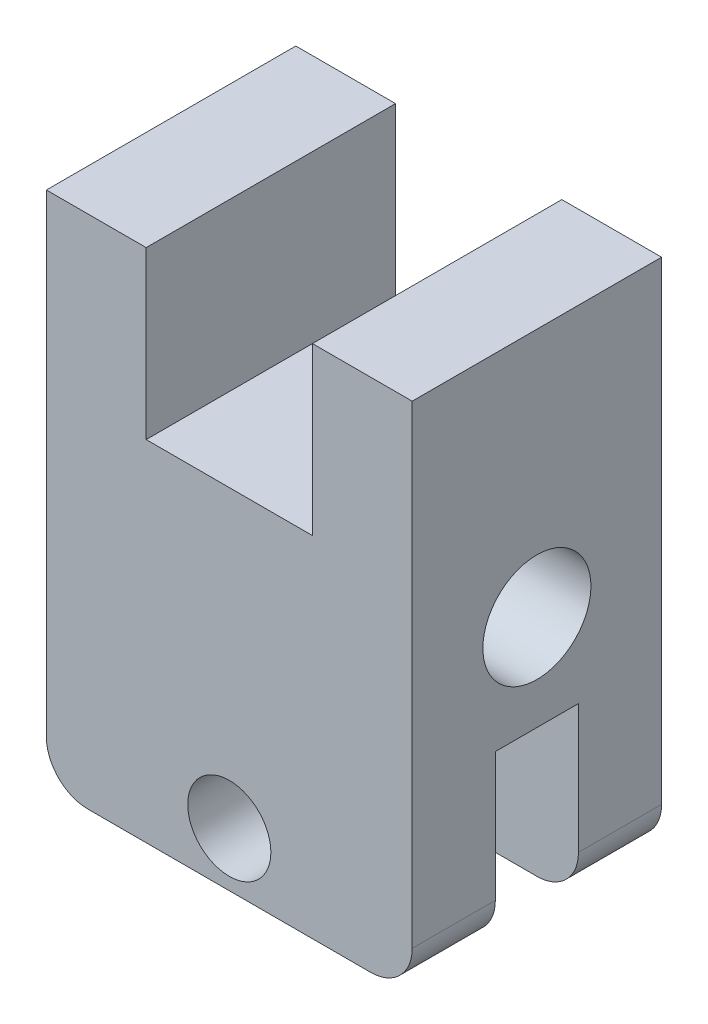
ISO-10303-21;
HEADER;
FILE_DESCRIPTION(('STEP AP214'),'2;1');
FILE_NAME('part.step','',(''),(''),'','','');
FILE_SCHEMA(('AUTOMOTIVE_DESIGN { 1 0 10303 214 1 1 1 1 }'));
ENDSEC;
DATA;
#1=APPLICATION_CONTEXT('core data for automotive mechanical design processes');
#2=APPLICATION_PROTOCOL_DEFINITION('international standard','automotive_design',2000,#1);
#3=PRODUCT_CONTEXT('',#1,'mechanical');
#4=PRODUCT('Part','Part','',(#3));
#5=PRODUCT_RELATED_PRODUCT_CATEGORY('part','',(#4));
#6=PRODUCT_DEFINITION_FORMATION('','',#4);
#7=PRODUCT_DEFINITION_CONTEXT('part definition',#1,'design');
#8=PRODUCT_DEFINITION('design','',#6,#7);
#9=PRODUCT_DEFINITION_SHAPE('','',#8);
#10=(LENGTH_UNIT() NAMED_UNIT(*) SI_UNIT(.MILLI.,.METRE.));
#11=(NAMED_UNIT(*) PLANE_ANGLE_UNIT() SI_UNIT($,.RADIAN.));
#12=(NAMED_UNIT(*) SI_UNIT($,.STERADIAN.) SOLID_ANGLE_UNIT());
#13=UNCERTAINTY_MEASURE_WITH_UNIT(LENGTH_MEASURE(1.E-05),#10,'distance_accuracy_value','');
#14=(GEOMETRIC_REPRESENTATION_CONTEXT(3) GLOBAL_UNCERTAINTY_ASSIGNED_CONTEXT((#13)) GLOBAL_UNIT_ASSIGNED_CONTEXT((#10,
#11,#12)) REPRESENTATION_CONTEXT('',''));
#15=CARTESIAN_POINT('',(0.,0.,0.));
#16=DIRECTION('',(0.,0.,1.));
#17=DIRECTION('',(1.,0.,0.));
#18=AXIS2_PLACEMENT_3D('',#15,#16,#17);
#19=CARTESIAN_POINT('',(-22.,4.99999999999999,15.));
#20=DIRECTION('',(1.,0.,0.));
#21=DIRECTION('',(0.,1.,0.));
#22=AXIS2_PLACEMENT_3D('',#19,#20,#21);
#23=CYLINDRICAL_SURFACE('',#22,7.5);
#24=CARTESIAN_POINT('',(-22.,4.99999999999999,15.));
#25=DIRECTION('',(1.,0.,0.));
#26=DIRECTION('',(0.,1.,0.));
#27=AXIS2_PLACEMENT_3D('',#24,#25,#26);
#28=CIRCLE('',#27,7.5);
#29=CARTESIAN_POINT('',(-22.,12.5,15.));
#30=VERTEX_POINT('',#29);
#31=EDGE_CURVE('E204',#30,#30,#28,.T.);
#32=ORIENTED_EDGE('',*,*,#31,.F.);
#33=EDGE_LOOP('',(#32));
#34=FACE_BOUND('',#33,.T.);
#35=CARTESIAN_POINT('',(12.,5.,15.));
#36=DIRECTION('',(1.,0.,0.));
#37=DIRECTION('',(0.,1.,0.));
#38=AXIS2_PLACEMENT_3D('',#35,#36,#37);
#39=CIRCLE('',#38,7.5);
#40=CARTESIAN_POINT('',(12.,12.5,15.));
#41=VERTEX_POINT('',#40);
#42=EDGE_CURVE('E11',#41,#41,#39,.F.);
#43=ORIENTED_EDGE('',*,*,#42,.F.);
#44=EDGE_LOOP('',(#43));
#45=FACE_BOUND('',#44,.T.);
#46=ADVANCED_FACE('F41',(#34,#45),#23,.F.);
#47=CARTESIAN_POINT('',(0.,-20.5,30.));
#48=DIRECTION('',(0.,0.,-1.));
#49=DIRECTION('',(-1.,0.,0.));
#50=AXIS2_PLACEMENT_3D('',#47,#48,#49);
#51=CYLINDRICAL_SURFACE('',#50,4.99999999999999);
#52=CARTESIAN_POINT('',(0.,-20.5,20.));
#53=DIRECTION('',(0.,0.,1.));
#54=DIRECTION('',(1.,0.,0.));
#55=AXIS2_PLACEMENT_3D('',#52,#53,#54);
#56=CIRCLE('',#55,4.99999999999999);
#57=CARTESIAN_POINT('',(5.,-20.5,20.));
#58=VERTEX_POINT('',#57);
#59=EDGE_CURVE('E209',#58,#58,#56,.T.);
#60=ORIENTED_EDGE('',*,*,#59,.F.);
#61=EDGE_LOOP('',(#60));
#62=FACE_BOUND('',#61,.T.);
#63=CARTESIAN_POINT('',(0.,-20.5,30.));
#64=DIRECTION('',(0.,0.,1.));
#65=DIRECTION('',(1.,0.,0.));
#66=AXIS2_PLACEMENT_3D('',#63,#64,#65);
#67=CIRCLE('',#66,4.99999999999999);
#68=CARTESIAN_POINT('',(5.,-20.5,30.));
#69=VERTEX_POINT('',#68);
#70=EDGE_CURVE('E210',#69,#69,#67,.T.);
#71=ORIENTED_EDGE('',*,*,#70,.T.);
#72=EDGE_LOOP('',(#71));
#73=FACE_BOUND('',#72,.T.);
#74=ADVANCED_FACE('F394',(#62,#73),#51,.F.);
#75=CARTESIAN_POINT('',(10.,0.,30.));
#76=DIRECTION('',(-1.,0.,0.));
#77=DIRECTION('',(0.,-1.,0.));
#78=AXIS2_PLACEMENT_3D('',#75,#76,#77);
#79=PLANE('',#78);
#80=DIRECTION('',(0.,1.,0.));
#81=VECTOR('',#80,1.);
#82=CARTESIAN_POINT('',(10.,0.,0.));
#83=LINE('',#82,#81);
#84=CARTESIAN_POINT('',(10.,15.,0.));
#85=VERTEX_POINT('',#84);
#86=CARTESIAN_POINT('',(10.,35.,0.));
#87=VERTEX_POINT('',#86);
#88=EDGE_CURVE('E241',#85,#87,#83,.T.);
#89=ORIENTED_EDGE('',*,*,#88,.F.);
#90=DIRECTION('',(0.,0.,-1.));
#91=VECTOR('',#90,1.);
#92=CARTESIAN_POINT('',(10.,15.,30.));
#93=LINE('',#92,#91);
#94=CARTESIAN_POINT('',(10.,15.,30.));
#95=VERTEX_POINT('',#94);
#96=EDGE_CURVE('E279',#95,#85,#93,.T.);
#97=ORIENTED_EDGE('',*,*,#96,.F.);
#98=DIRECTION('',(0.,1.,0.));
#99=VECTOR('',#98,1.);
#100=CARTESIAN_POINT('',(10.,0.,30.));
#101=LINE('',#100,#99);
#102=CARTESIAN_POINT('',(10.,35.,30.));
#103=VERTEX_POINT('',#102);
#104=EDGE_CURVE('E214',#95,#103,#101,.T.);
#105=ORIENTED_EDGE('',*,*,#104,.T.);
#106=DIRECTION('',(0.,0.,-1.));
#107=VECTOR('',#106,1.);
#108=CARTESIAN_POINT('',(10.,35.,30.));
#109=LINE('',#108,#107);
#110=EDGE_CURVE('E264',#103,#87,#109,.T.);
#111=ORIENTED_EDGE('',*,*,#110,.T.);
#112=EDGE_LOOP('',(#89,#97,#105,#111));
#113=FACE_BOUND('',#112,.T.);
#114=ADVANCED_FACE('F405',(#113),#79,.T.);
#115=CARTESIAN_POINT('',(0.,15.,30.));
#116=DIRECTION('',(0.,1.,0.));
#117=DIRECTION('',(0.,0.,1.));
#118=AXIS2_PLACEMENT_3D('',#115,#116,#117);
#119=PLANE('',#118);
#120=DIRECTION('',(1.,0.,0.));
#121=VECTOR('',#120,1.);
#122=CARTESIAN_POINT('',(0.,15.,0.));
#123=LINE('',#122,#121);
#124=CARTESIAN_POINT('',(-9.99999999999999,15.,0.));
#125=VERTEX_POINT('',#124);
#126=EDGE_CURVE('E245',#125,#85,#123,.T.);
#127=ORIENTED_EDGE('',*,*,#126,.F.);
#128=DIRECTION('',(0.,0.,-1.));
#129=VECTOR('',#128,1.);
#130=CARTESIAN_POINT('',(-9.99999999999999,15.,30.));
#131=LINE('',#130,#129);
#132=CARTESIAN_POINT('',(-9.99999999999999,15.,30.));
#133=VERTEX_POINT('',#132);
#134=EDGE_CURVE('E276',#133,#125,#131,.T.);
#135=ORIENTED_EDGE('',*,*,#134,.F.);
#136=DIRECTION('',(1.,0.,0.));
#137=VECTOR('',#136,1.);
#138=CARTESIAN_POINT('',(0.,15.,30.));
#139=LINE('',#138,#137);
#140=EDGE_CURVE('E219',#133,#95,#139,.T.);
#141=ORIENTED_EDGE('',*,*,#140,.T.);
#142=ORIENTED_EDGE('',*,*,#96,.T.);
#143=EDGE_LOOP('',(#127,#135,#141,#142));
#144=FACE_BOUND('',#143,.T.);
#145=ADVANCED_FACE('F429',(#144),#119,.T.);
#146=CARTESIAN_POINT('',(-9.99999999999999,0.,30.));
#147=DIRECTION('',(-1.,0.,0.));
#148=DIRECTION('',(0.,0.,1.));
#149=AXIS2_PLACEMENT_3D('',#146,#147,#148);
#150=PLANE('',#149);
#151=DIRECTION('',(0.,1.,0.));
#152=VECTOR('',#151,1.);
#153=CARTESIAN_POINT('',(-9.99999999999999,0.,0.));
#154=LINE('',#153,#152);
#155=CARTESIAN_POINT('',(-9.99999999999999,35.,0.));
#156=VERTEX_POINT('',#155);
#157=EDGE_CURVE('E249',#125,#156,#154,.T.);
#158=ORIENTED_EDGE('',*,*,#157,.T.);
#159=DIRECTION('',(0.,0.,-1.));
#160=VECTOR('',#159,1.);
#161=CARTESIAN_POINT('',(-9.99999999999999,35.,30.));
#162=LINE('',#161,#160);
#163=CARTESIAN_POINT('',(-9.99999999999999,35.,30.));
#164=VERTEX_POINT('',#163);
#165=EDGE_CURVE('E273',#164,#156,#162,.T.);
#166=ORIENTED_EDGE('',*,*,#165,.F.);
#167=DIRECTION('',(0.,1.,0.));
#168=VECTOR('',#167,1.);
#169=CARTESIAN_POINT('',(-9.99999999999999,0.,30.));
#170=LINE('',#169,#168);
#171=EDGE_CURVE('E223',#133,#164,#170,.T.);
#172=ORIENTED_EDGE('',*,*,#171,.F.);
#173=ORIENTED_EDGE('',*,*,#134,.T.);
#174=EDGE_LOOP('',(#158,#166,#172,#173));
#175=FACE_BOUND('',#174,.T.);
#176=ADVANCED_FACE('F424',(#175),#150,.F.);
#177=CARTESIAN_POINT('',(0.,35.,30.));
#178=DIRECTION('',(0.,1.,0.));
#179=DIRECTION('',(0.,0.,1.));
#180=AXIS2_PLACEMENT_3D('',#177,#178,#179);
#181=PLANE('',#180);
#182=DIRECTION('',(1.,0.,0.));
#183=VECTOR('',#182,1.);
#184=CARTESIAN_POINT('',(0.,35.,0.));
#185=LINE('',#184,#183);
#186=CARTESIAN_POINT('',(-22.,35.,0.));
#187=VERTEX_POINT('',#186);
#188=EDGE_CURVE('E253',#187,#156,#185,.T.);
#189=ORIENTED_EDGE('',*,*,#188,.F.);
#190=DIRECTION('',(0.,0.,-1.));
#191=VECTOR('',#190,1.);
#192=CARTESIAN_POINT('',(-22.,35.,30.));
#193=LINE('',#192,#191);
#194=CARTESIAN_POINT('',(-22.,35.,30.));
#195=VERTEX_POINT('',#194);
#196=EDGE_CURVE('E270',#195,#187,#193,.T.);
#197=ORIENTED_EDGE('',*,*,#196,.F.);
#198=DIRECTION('',(1.,0.,0.));
#199=VECTOR('',#198,1.);
#200=CARTESIAN_POINT('',(0.,35.,30.));
#201=LINE('',#200,#199);
#202=EDGE_CURVE('E226',#195,#164,#201,.T.);
#203=ORIENTED_EDGE('',*,*,#202,.T.);
#204=ORIENTED_EDGE('',*,*,#165,.T.);
#205=EDGE_LOOP('',(#189,#197,#203,#204));
#206=FACE_BOUND('',#205,.T.);
#207=ADVANCED_FACE('F395',(#206),#181,.T.);
#208=CARTESIAN_POINT('',(-22.,0.,30.));
#209=DIRECTION('',(1.,0.,0.));
#210=DIRECTION('',(0.,1.,0.));
#211=AXIS2_PLACEMENT_3D('',#208,#209,#210);
#212=PLANE('',#211);
#213=ORIENTED_EDGE('',*,*,#31,.T.);
#214=EDGE_LOOP('',(#213));
#215=FACE_BOUND('',#214,.T.);
#216=DIRECTION('',(0.,-1.,0.));
#217=VECTOR('',#216,1.);
#218=CARTESIAN_POINT('',(-22.,0.,0.));
#219=LINE('',#218,#217);
#220=CARTESIAN_POINT('',(-22.,-22.,0.));
#221=VERTEX_POINT('',#220);
#222=EDGE_CURVE('E257',#187,#221,#219,.T.);
#223=ORIENTED_EDGE('',*,*,#222,.T.);
#224=DIRECTION('',(0.,0.,1.));
#225=VECTOR('',#224,1.);
#226=CARTESIAN_POINT('',(-22.,-22.,30.));
#227=LINE('',#226,#225);
#228=CARTESIAN_POINT('',(-22.,-22.,10.));
#229=VERTEX_POINT('',#228);
#230=EDGE_CURVE('E168',#221,#229,#227,.T.);
#231=ORIENTED_EDGE('',*,*,#230,.T.);
#232=DIRECTION('',(0.,1.,0.));
#233=VECTOR('',#232,1.);
#234=CARTESIAN_POINT('',(-22.,-35.,10.));
#235=LINE('',#234,#233);
#236=CARTESIAN_POINT('',(-22.,-6.49999999999999,10.));
#237=VERTEX_POINT('',#236);
#238=EDGE_CURVE('E160',#229,#237,#235,.T.);
#239=ORIENTED_EDGE('',*,*,#238,.T.);
#240=DIRECTION('',(0.,0.,1.));
#241=VECTOR('',#240,1.);
#242=CARTESIAN_POINT('',(-22.,-6.49999999999999,10.));
#243=LINE('',#242,#241);
#244=CARTESIAN_POINT('',(-22.,-6.49999999999999,20.));
#245=VERTEX_POINT('',#244);
#246=EDGE_CURVE('E166',#237,#245,#243,.T.);
#247=ORIENTED_EDGE('',*,*,#246,.T.);
#248=DIRECTION('',(0.,-1.,0.));
#249=VECTOR('',#248,1.);
#250=CARTESIAN_POINT('',(-22.,-35.,20.));
#251=LINE('',#250,#249);
#252=CARTESIAN_POINT('',(-22.,-22.,20.));
#253=VERTEX_POINT('',#252);
#254=EDGE_CURVE('E183',#245,#253,#251,.T.);
#255=ORIENTED_EDGE('',*,*,#254,.T.);
#256=DIRECTION('',(0.,0.,1.));
#257=VECTOR('',#256,1.);
#258=CARTESIAN_POINT('',(-22.,-22.,30.));
#259=LINE('',#258,#257);
#260=CARTESIAN_POINT('',(-22.,-22.,30.));
#261=VERTEX_POINT('',#260);
#262=EDGE_CURVE('E292',#253,#261,#259,.T.);
#263=ORIENTED_EDGE('',*,*,#262,.T.);
#264=DIRECTION('',(0.,-1.,0.));
#265=VECTOR('',#264,1.);
#266=CARTESIAN_POINT('',(-22.,0.,30.));
#267=LINE('',#266,#265);
#268=EDGE_CURVE('E230',#195,#261,#267,.T.);
#269=ORIENTED_EDGE('',*,*,#268,.F.);
#270=ORIENTED_EDGE('',*,*,#196,.T.);
#271=EDGE_LOOP('',(#223,#231,#239,#247,#255,#263,#269,#270));
#272=FACE_BOUND('',#271,.T.);
#273=ADVANCED_FACE('F163',(#215,#272),#212,.F.);
#274=CARTESIAN_POINT('',(22.,0.,30.));
#275=DIRECTION('',(1.,0.,0.));
#276=DIRECTION('',(0.,1.,0.));
#277=AXIS2_PLACEMENT_3D('',#274,#275,#276);
#278=PLANE('',#277);
#279=DIRECTION('',(0.,1.,0.));
#280=VECTOR('',#279,1.);
#281=CARTESIAN_POINT('',(22.,-35.,10.));
#282=LINE('',#281,#280);
#283=CARTESIAN_POINT('',(22.,-22.,10.));
#284=VERTEX_POINT('',#283);
#285=CARTESIAN_POINT('',(22.,-6.49999999999999,10.));
#286=VERTEX_POINT('',#285);
#287=EDGE_CURVE('E177',#284,#286,#282,.T.);
#288=ORIENTED_EDGE('',*,*,#287,.F.);
#289=DIRECTION('',(0.,0.,1.));
#290=VECTOR('',#289,1.);
#291=CARTESIAN_POINT('',(22.,-22.,0.));
#292=LINE('',#291,#290);
#293=CARTESIAN_POINT('',(22.,-22.,0.));
#294=VERTEX_POINT('',#293);
#295=EDGE_CURVE('E50',#284,#294,#292,.F.);
#296=ORIENTED_EDGE('',*,*,#295,.T.);
#297=DIRECTION('',(0.,-1.,0.));
#298=VECTOR('',#297,1.);
#299=CARTESIAN_POINT('',(22.,0.,0.));
#300=LINE('',#299,#298);
#301=CARTESIAN_POINT('',(22.,35.,0.));
#302=VERTEX_POINT('',#301);
#303=EDGE_CURVE('E260',#302,#294,#300,.T.);
#304=ORIENTED_EDGE('',*,*,#303,.F.);
#305=DIRECTION('',(0.,0.,-1.));
#306=VECTOR('',#305,1.);
#307=CARTESIAN_POINT('',(22.,35.,30.));
#308=LINE('',#307,#306);
#309=CARTESIAN_POINT('',(22.,35.,30.));
#310=VERTEX_POINT('',#309);
#311=EDGE_CURVE('E267',#310,#302,#308,.T.);
#312=ORIENTED_EDGE('',*,*,#311,.F.);
#313=DIRECTION('',(0.,-1.,0.));
#314=VECTOR('',#313,1.);
#315=CARTESIAN_POINT('',(22.,0.,30.));
#316=LINE('',#315,#314);
#317=CARTESIAN_POINT('',(22.,-22.,30.));
#318=VERTEX_POINT('',#317);
#319=EDGE_CURVE('E235',#310,#318,#316,.T.);
#320=ORIENTED_EDGE('',*,*,#319,.T.);
#321=DIRECTION('',(0.,0.,1.));
#322=VECTOR('',#321,1.);
#323=CARTESIAN_POINT('',(22.,-22.,20.));
#324=LINE('',#323,#322);
#325=CARTESIAN_POINT('',(22.,-22.,20.));
#326=VERTEX_POINT('',#325);
#327=EDGE_CURVE('E57',#318,#326,#324,.F.);
#328=ORIENTED_EDGE('',*,*,#327,.T.);
#329=DIRECTION('',(0.,-1.,0.));
#330=VECTOR('',#329,1.);
#331=CARTESIAN_POINT('',(22.,-35.,20.));
#332=LINE('',#331,#330);
#333=CARTESIAN_POINT('',(22.,-6.49999999999999,20.));
#334=VERTEX_POINT('',#333);
#335=EDGE_CURVE('E171',#334,#326,#332,.T.);
#336=ORIENTED_EDGE('',*,*,#335,.F.);
#337=DIRECTION('',(0.,0.,1.));
#338=VECTOR('',#337,1.);
#339=CARTESIAN_POINT('',(22.,-6.49999999999999,10.));
#340=LINE('',#339,#338);
#341=EDGE_CURVE('E195',#286,#334,#340,.T.);
#342=ORIENTED_EDGE('',*,*,#341,.F.);
#343=EDGE_LOOP('',(#288,#296,#304,#312,#320,#328,#336,#342));
#344=FACE_BOUND('',#343,.T.);
#345=CARTESIAN_POINT('',(22.,5.,15.));
#346=DIRECTION('',(1.,0.,0.));
#347=DIRECTION('',(0.,1.,0.));
#348=AXIS2_PLACEMENT_3D('',#345,#346,#347);
#349=CIRCLE('',#348,6.5);
#350=CARTESIAN_POINT('',(22.,11.5,15.));
#351=VERTEX_POINT('',#350);
#352=EDGE_CURVE('E368',#351,#351,#349,.T.);
#353=ORIENTED_EDGE('',*,*,#352,.F.);
#354=EDGE_LOOP('',(#353));
#355=FACE_BOUND('',#354,.T.);
#356=ADVANCED_FACE('F339',(#344,#355),#278,.T.);
#357=CARTESIAN_POINT('',(0.,-20.5,10.));
#358=DIRECTION('',(0.,0.,-1.));
#359=DIRECTION('',(-1.,0.,0.));
#360=AXIS2_PLACEMENT_3D('',#357,#358,#359);
#361=CIRCLE('',#360,4.99999999999999);
#362=CARTESIAN_POINT('',(-4.99999999999999,-20.5,10.));
#363=VERTEX_POINT('',#362);
#364=EDGE_CURVE('E202',#363,#363,#361,.T.);
#365=ORIENTED_EDGE('',*,*,#364,.F.);
#366=EDGE_LOOP('',(#365));
#367=FACE_BOUND('',#366,.T.);
#368=CARTESIAN_POINT('',(0.,-20.5,0.));
#369=DIRECTION('',(0.,0.,1.));
#370=DIRECTION('',(1.,0.,0.));
#371=AXIS2_PLACEMENT_3D('',#368,#369,#370);
#372=CIRCLE('',#371,4.99999999999999);
#373=CARTESIAN_POINT('',(5.,-20.5,0.));
#374=VERTEX_POINT('',#373);
#375=EDGE_CURVE('E208',#374,#374,#372,.T.);
#376=ORIENTED_EDGE('',*,*,#375,.F.);
#377=EDGE_LOOP('',(#376));
#378=FACE_BOUND('',#377,.T.);
#379=ADVANCED_FACE('F385',(#367,#378),#51,.F.);
#380=EDGE_CURVE('E215',#87,#302,#185,.T.);
#381=ORIENTED_EDGE('',*,*,#380,.F.);
#382=ORIENTED_EDGE('',*,*,#110,.F.);
#383=EDGE_CURVE('E231',#103,#310,#201,.T.);
#384=ORIENTED_EDGE('',*,*,#383,.T.);
#385=ORIENTED_EDGE('',*,*,#311,.T.);
#386=EDGE_LOOP('',(#381,#382,#384,#385));
#387=FACE_BOUND('',#386,.T.);
#388=ADVANCED_FACE('F391',(#387),#181,.T.);
#389=CARTESIAN_POINT('',(0.,0.,30.));
#390=DIRECTION('',(0.,0.,1.));
#391=DIRECTION('',(1.,0.,0.));
#392=AXIS2_PLACEMENT_3D('',#389,#390,#391);
#393=PLANE('',#392);
#394=ORIENTED_EDGE('',*,*,#268,.T.);
#395=CARTESIAN_POINT('',(-17.,-22.,30.));
#396=DIRECTION('',(0.,0.,1.));
#397=DIRECTION('',(1.,0.,0.));
#398=AXIS2_PLACEMENT_3D('',#395,#396,#397);
#399=CIRCLE('',#398,5.);
#400=CARTESIAN_POINT('',(-17.,-27.,30.));
#401=VERTEX_POINT('',#400);
#402=EDGE_CURVE('E320',#261,#401,#399,.T.);
#403=ORIENTED_EDGE('',*,*,#402,.T.);
#404=DIRECTION('',(-1.,0.,0.));
#405=VECTOR('',#404,1.);
#406=CARTESIAN_POINT('',(-22.,-27.,30.));
#407=LINE('',#406,#405);
#408=CARTESIAN_POINT('',(17.,-27.,30.));
#409=VERTEX_POINT('',#408);
#410=EDGE_CURVE('E361',#409,#401,#407,.T.);
#411=ORIENTED_EDGE('',*,*,#410,.F.);
#412=CARTESIAN_POINT('',(17.,-22.,30.));
#413=DIRECTION('',(0.,0.,1.));
#414=DIRECTION('',(1.,0.,0.));
#415=AXIS2_PLACEMENT_3D('',#412,#413,#414);
#416=CIRCLE('',#415,5.);
#417=EDGE_CURVE('E317',#409,#318,#416,.T.);
#418=ORIENTED_EDGE('',*,*,#417,.T.);
#419=ORIENTED_EDGE('',*,*,#319,.F.);
#420=ORIENTED_EDGE('',*,*,#383,.F.);
#421=ORIENTED_EDGE('',*,*,#104,.F.);
#422=ORIENTED_EDGE('',*,*,#140,.F.);
#423=ORIENTED_EDGE('',*,*,#171,.T.);
#424=ORIENTED_EDGE('',*,*,#202,.F.);
#425=EDGE_LOOP('',(#394,#403,#411,#418,#419,#420,#421,#422,#423,#424));
#426=FACE_BOUND('',#425,.T.);
#427=ORIENTED_EDGE('',*,*,#70,.F.);
#428=EDGE_LOOP('',(#427));
#429=FACE_BOUND('',#428,.T.);
#430=ADVANCED_FACE('F412',(#426,#429),#393,.T.);
#431=CARTESIAN_POINT('',(0.,0.,0.));
#432=DIRECTION('',(0.,0.,1.));
#433=DIRECTION('',(1.,0.,0.));
#434=AXIS2_PLACEMENT_3D('',#431,#432,#433);
#435=PLANE('',#434);
#436=ORIENTED_EDGE('',*,*,#375,.T.);
#437=EDGE_LOOP('',(#436));
#438=FACE_BOUND('',#437,.T.);
#439=DIRECTION('',(-1.,0.,0.));
#440=VECTOR('',#439,1.);
#441=CARTESIAN_POINT('',(-22.,-27.,0.));
#442=LINE('',#441,#440);
#443=CARTESIAN_POINT('',(17.,-27.,0.));
#444=VERTEX_POINT('',#443);
#445=CARTESIAN_POINT('',(-17.,-27.,0.));
#446=VERTEX_POINT('',#445);
#447=EDGE_CURVE('E355',#444,#446,#442,.T.);
#448=ORIENTED_EDGE('',*,*,#447,.T.);
#449=CARTESIAN_POINT('',(-17.,-22.,0.));
#450=DIRECTION('',(0.,0.,1.));
#451=DIRECTION('',(1.,0.,0.));
#452=AXIS2_PLACEMENT_3D('',#449,#450,#451);
#453=CIRCLE('',#452,5.);
#454=EDGE_CURVE('E314',#446,#221,#453,.F.);
#455=ORIENTED_EDGE('',*,*,#454,.T.);
#456=ORIENTED_EDGE('',*,*,#222,.F.);
#457=ORIENTED_EDGE('',*,*,#188,.T.);
#458=ORIENTED_EDGE('',*,*,#157,.F.);
#459=ORIENTED_EDGE('',*,*,#126,.T.);
#460=ORIENTED_EDGE('',*,*,#88,.T.);
#461=ORIENTED_EDGE('',*,*,#380,.T.);
#462=ORIENTED_EDGE('',*,*,#303,.T.);
#463=CARTESIAN_POINT('',(17.,-22.,0.));
#464=DIRECTION('',(0.,0.,1.));
#465=DIRECTION('',(1.,0.,0.));
#466=AXIS2_PLACEMENT_3D('',#463,#464,#465);
#467=CIRCLE('',#466,5.);
#468=EDGE_CURVE('E311',#294,#444,#467,.F.);
#469=ORIENTED_EDGE('',*,*,#468,.T.);
#470=EDGE_LOOP('',(#448,#455,#456,#457,#458,#459,#460,#461,#462,#469));
#471=FACE_BOUND('',#470,.T.);
#472=ADVANCED_FACE('F346',(#438,#471),#435,.F.);
#473=CARTESIAN_POINT('',(-22.,-35.,20.));
#474=DIRECTION('',(0.,0.,1.));
#475=DIRECTION('',(1.,0.,0.));
#476=AXIS2_PLACEMENT_3D('',#473,#474,#475);
#477=PLANE('',#476);
#478=ORIENTED_EDGE('',*,*,#59,.T.);
#479=EDGE_LOOP('',(#478));
#480=FACE_BOUND('',#479,.T.);
#481=DIRECTION('',(-1.,0.,0.));
#482=VECTOR('',#481,1.);
#483=CARTESIAN_POINT('',(-22.,-27.,20.));
#484=LINE('',#483,#482);
#485=CARTESIAN_POINT('',(17.,-27.,20.));
#486=VERTEX_POINT('',#485);
#487=CARTESIAN_POINT('',(-17.,-27.,20.));
#488=VERTEX_POINT('',#487);
#489=EDGE_CURVE('E196',#486,#488,#484,.T.);
#490=ORIENTED_EDGE('',*,*,#489,.T.);
#491=CARTESIAN_POINT('',(-17.,-22.,20.));
#492=DIRECTION('',(0.,0.,1.));
#493=DIRECTION('',(1.,0.,0.));
#494=AXIS2_PLACEMENT_3D('',#491,#492,#493);
#495=CIRCLE('',#494,5.);
#496=EDGE_CURVE('E332',#488,#253,#495,.F.);
#497=ORIENTED_EDGE('',*,*,#496,.T.);
#498=ORIENTED_EDGE('',*,*,#254,.F.);
#499=DIRECTION('',(1.,0.,0.));
#500=VECTOR('',#499,1.);
#501=CARTESIAN_POINT('',(-22.,-6.49999999999999,20.));
#502=LINE('',#501,#500);
#503=EDGE_CURVE('E182',#245,#334,#502,.T.);
#504=ORIENTED_EDGE('',*,*,#503,.T.);
#505=ORIENTED_EDGE('',*,*,#335,.T.);
#506=CARTESIAN_POINT('',(17.,-22.,20.));
#507=DIRECTION('',(0.,0.,1.));
#508=DIRECTION('',(1.,0.,0.));
#509=AXIS2_PLACEMENT_3D('',#506,#507,#508);
#510=CIRCLE('',#509,5.);
#511=EDGE_CURVE('E329',#326,#486,#510,.F.);
#512=ORIENTED_EDGE('',*,*,#511,.T.);
#513=EDGE_LOOP('',(#490,#497,#498,#504,#505,#512));
#514=FACE_BOUND('',#513,.T.);
#515=ADVANCED_FACE('F417',(#480,#514),#477,.F.);
#516=CARTESIAN_POINT('',(-22.,-6.49999999999999,10.));
#517=DIRECTION('',(0.,1.,0.));
#518=DIRECTION('',(-1.,0.,0.));
#519=AXIS2_PLACEMENT_3D('',#516,#517,#518);
#520=PLANE('',#519);
#521=ORIENTED_EDGE('',*,*,#341,.T.);
#522=ORIENTED_EDGE('',*,*,#503,.F.);
#523=ORIENTED_EDGE('',*,*,#246,.F.);
#524=DIRECTION('',(1.,0.,0.));
#525=VECTOR('',#524,1.);
#526=CARTESIAN_POINT('',(-22.,-6.49999999999999,10.));
#527=LINE('',#526,#525);
#528=EDGE_CURVE('E174',#237,#286,#527,.T.);
#529=ORIENTED_EDGE('',*,*,#528,.T.);
#530=EDGE_LOOP('',(#521,#522,#523,#529));
#531=FACE_BOUND('',#530,.T.);
#532=ADVANCED_FACE('F185',(#531),#520,.F.);
#533=CARTESIAN_POINT('',(-22.,-35.,10.));
#534=DIRECTION('',(0.,0.,-1.));
#535=DIRECTION('',(-1.,0.,0.));
#536=AXIS2_PLACEMENT_3D('',#533,#534,#535);
#537=PLANE('',#536);
#538=ORIENTED_EDGE('',*,*,#364,.T.);
#539=EDGE_LOOP('',(#538));
#540=FACE_BOUND('',#539,.T.);
#541=ORIENTED_EDGE('',*,*,#238,.F.);
#542=CARTESIAN_POINT('',(-17.,-22.,10.));
#543=DIRECTION('',(0.,0.,-1.));
#544=DIRECTION('',(-1.,0.,0.));
#545=AXIS2_PLACEMENT_3D('',#542,#543,#544);
#546=CIRCLE('',#545,5.);
#547=CARTESIAN_POINT('',(-17.,-27.,10.));
#548=VERTEX_POINT('',#547);
#549=EDGE_CURVE('E301',#229,#548,#546,.F.);
#550=ORIENTED_EDGE('',*,*,#549,.T.);
#551=DIRECTION('',(1.,0.,0.));
#552=VECTOR('',#551,1.);
#553=CARTESIAN_POINT('',(-22.,-27.,10.));
#554=LINE('',#553,#552);
#555=CARTESIAN_POINT('',(17.,-27.,10.));
#556=VERTEX_POINT('',#555);
#557=EDGE_CURVE('E282',#548,#556,#554,.T.);
#558=ORIENTED_EDGE('',*,*,#557,.T.);
#559=CARTESIAN_POINT('',(17.,-22.,10.));
#560=DIRECTION('',(0.,0.,-1.));
#561=DIRECTION('',(-1.,0.,0.));
#562=AXIS2_PLACEMENT_3D('',#559,#560,#561);
#563=CIRCLE('',#562,5.);
#564=EDGE_CURVE('E298',#556,#284,#563,.F.);
#565=ORIENTED_EDGE('',*,*,#564,.T.);
#566=ORIENTED_EDGE('',*,*,#287,.T.);
#567=ORIENTED_EDGE('',*,*,#528,.F.);
#568=EDGE_LOOP('',(#541,#550,#558,#565,#566,#567));
#569=FACE_BOUND('',#568,.T.);
#570=ADVANCED_FACE('F175',(#540,#569),#537,.F.);
#571=CARTESIAN_POINT('',(-22.,-27.,0.));
#572=DIRECTION('',(0.,1.,0.));
#573=DIRECTION('',(0.,0.,1.));
#574=AXIS2_PLACEMENT_3D('',#571,#572,#573);
#575=PLANE('',#574);
#576=ORIENTED_EDGE('',*,*,#557,.F.);
#577=DIRECTION('',(0.,0.,1.));
#578=VECTOR('',#577,1.);
#579=CARTESIAN_POINT('',(-17.,-27.,0.));
#580=LINE('',#579,#578);
#581=EDGE_CURVE('E308',#548,#446,#580,.F.);
#582=ORIENTED_EDGE('',*,*,#581,.T.);
#583=ORIENTED_EDGE('',*,*,#447,.F.);
#584=DIRECTION('',(0.,0.,1.));
#585=VECTOR('',#584,1.);
#586=CARTESIAN_POINT('',(17.,-27.,10.));
#587=LINE('',#586,#585);
#588=EDGE_CURVE('E304',#444,#556,#587,.T.);
#589=ORIENTED_EDGE('',*,*,#588,.T.);
#590=EDGE_LOOP('',(#576,#582,#583,#589));
#591=FACE_BOUND('',#590,.T.);
#592=ADVANCED_FACE('F353',(#591),#575,.F.);
#593=ORIENTED_EDGE('',*,*,#410,.T.);
#594=DIRECTION('',(0.,0.,1.));
#595=VECTOR('',#594,1.);
#596=CARTESIAN_POINT('',(-17.,-27.,0.));
#597=LINE('',#596,#595);
#598=EDGE_CURVE('E65',#401,#488,#597,.F.);
#599=ORIENTED_EDGE('',*,*,#598,.T.);
#600=ORIENTED_EDGE('',*,*,#489,.F.);
#601=DIRECTION('',(0.,0.,1.));
#602=VECTOR('',#601,1.);
#603=CARTESIAN_POINT('',(17.,-27.,30.));
#604=LINE('',#603,#602);
#605=EDGE_CURVE('E323',#486,#409,#604,.T.);
#606=ORIENTED_EDGE('',*,*,#605,.T.);
#607=EDGE_LOOP('',(#593,#599,#600,#606));
#608=FACE_BOUND('',#607,.T.);
#609=ADVANCED_FACE('F457',(#608),#575,.F.);
#610=CARTESIAN_POINT('',(-17.,-22.,30.));
#611=DIRECTION('',(0.,0.,1.));
#612=DIRECTION('',(1.,0.,0.));
#613=AXIS2_PLACEMENT_3D('',#610,#611,#612);
#614=CYLINDRICAL_SURFACE('',#613,5.);
#615=ORIENTED_EDGE('',*,*,#454,.F.);
#616=ORIENTED_EDGE('',*,*,#581,.F.);
#617=ORIENTED_EDGE('',*,*,#549,.F.);
#618=ORIENTED_EDGE('',*,*,#230,.F.);
#619=EDGE_LOOP('',(#615,#616,#617,#618));
#620=FACE_BOUND('',#619,.T.);
#621=ADVANCED_FACE('F358',(#620),#614,.T.);
#622=CARTESIAN_POINT('',(-17.,-22.,30.));
#623=DIRECTION('',(0.,0.,1.));
#624=DIRECTION('',(1.,0.,0.));
#625=AXIS2_PLACEMENT_3D('',#622,#623,#624);
#626=CYLINDRICAL_SURFACE('',#625,5.);
#627=ORIENTED_EDGE('',*,*,#496,.F.);
#628=ORIENTED_EDGE('',*,*,#598,.F.);
#629=ORIENTED_EDGE('',*,*,#402,.F.);
#630=ORIENTED_EDGE('',*,*,#262,.F.);
#631=EDGE_LOOP('',(#627,#628,#629,#630));
#632=FACE_BOUND('',#631,.T.);
#633=ADVANCED_FACE('F459',(#632),#626,.T.);
#634=CARTESIAN_POINT('',(17.,-22.,0.));
#635=DIRECTION('',(0.,0.,-1.));
#636=DIRECTION('',(-1.,0.,0.));
#637=AXIS2_PLACEMENT_3D('',#634,#635,#636);
#638=CYLINDRICAL_SURFACE('',#637,5.);
#639=ORIENTED_EDGE('',*,*,#468,.F.);
#640=ORIENTED_EDGE('',*,*,#295,.F.);
#641=ORIENTED_EDGE('',*,*,#564,.F.);
#642=ORIENTED_EDGE('',*,*,#588,.F.);
#643=EDGE_LOOP('',(#639,#640,#641,#642));
#644=FACE_BOUND('',#643,.T.);
#645=ADVANCED_FACE('F350',(#644),#638,.T.);
#646=CARTESIAN_POINT('',(17.,-22.,0.));
#647=DIRECTION('',(0.,0.,-1.));
#648=DIRECTION('',(-1.,0.,0.));
#649=AXIS2_PLACEMENT_3D('',#646,#647,#648);
#650=CYLINDRICAL_SURFACE('',#649,5.);
#651=ORIENTED_EDGE('',*,*,#511,.F.);
#652=ORIENTED_EDGE('',*,*,#327,.F.);
#653=ORIENTED_EDGE('',*,*,#417,.F.);
#654=ORIENTED_EDGE('',*,*,#605,.F.);
#655=EDGE_LOOP('',(#651,#652,#653,#654));
#656=FACE_BOUND('',#655,.T.);
#657=ADVANCED_FACE('F43',(#656),#650,.T.);
#658=CARTESIAN_POINT('',(12.,5.,15.));
#659=DIRECTION('',(1.,0.,0.));
#660=DIRECTION('',(0.,1.,0.));
#661=AXIS2_PLACEMENT_3D('',#658,#659,#660);
#662=PLANE('',#661);
#663=CARTESIAN_POINT('',(12.,5.,15.));
#664=DIRECTION('',(1.,0.,0.));
#665=DIRECTION('',(0.,1.,0.));
#666=AXIS2_PLACEMENT_3D('',#663,#664,#665);
#667=CIRCLE('',#666,6.5);
#668=CARTESIAN_POINT('',(12.,11.5,15.));
#669=VERTEX_POINT('',#668);
#670=EDGE_CURVE('E365',#669,#669,#667,.T.);
#671=ORIENTED_EDGE('',*,*,#670,.T.);
#672=EDGE_LOOP('',(#671));
#673=FACE_BOUND('',#672,.T.);
#674=ORIENTED_EDGE('',*,*,#42,.T.);
#675=EDGE_LOOP('',(#674));
#676=FACE_BOUND('',#675,.T.);
#677=ADVANCED_FACE('F376',(#673,#676),#662,.F.);
#678=CARTESIAN_POINT('',(12.,5.,15.));
#679=DIRECTION('',(1.,0.,0.));
#680=DIRECTION('',(0.,1.,0.));
#681=AXIS2_PLACEMENT_3D('',#678,#679,#680);
#682=CYLINDRICAL_SURFACE('',#681,6.5);
#683=ORIENTED_EDGE('',*,*,#670,.F.);
#684=EDGE_LOOP('',(#683));
#685=FACE_BOUND('',#684,.T.);
#686=ORIENTED_EDGE('',*,*,#352,.T.);
#687=EDGE_LOOP('',(#686));
#688=FACE_BOUND('',#687,.T.);
#689=ADVANCED_FACE('F379',(#685,#688),#682,.F.);
#690=CLOSED_SHELL('',(#46,#74,#114,#145,#176,#207,#273,#356,#379,#388,#430,#472,#515,#532,#570,
#592,#609,#621,#633,#645,#657,#677,#689));
#691=MANIFOLD_SOLID_BREP('B2',#690);
#692=ADVANCED_BREP_SHAPE_REPRESENTATION('',(#18,#691),#14);
#693=SHAPE_DEFINITION_REPRESENTATION(#9,#692);
ENDSEC;
END-ISO-10303-21;
